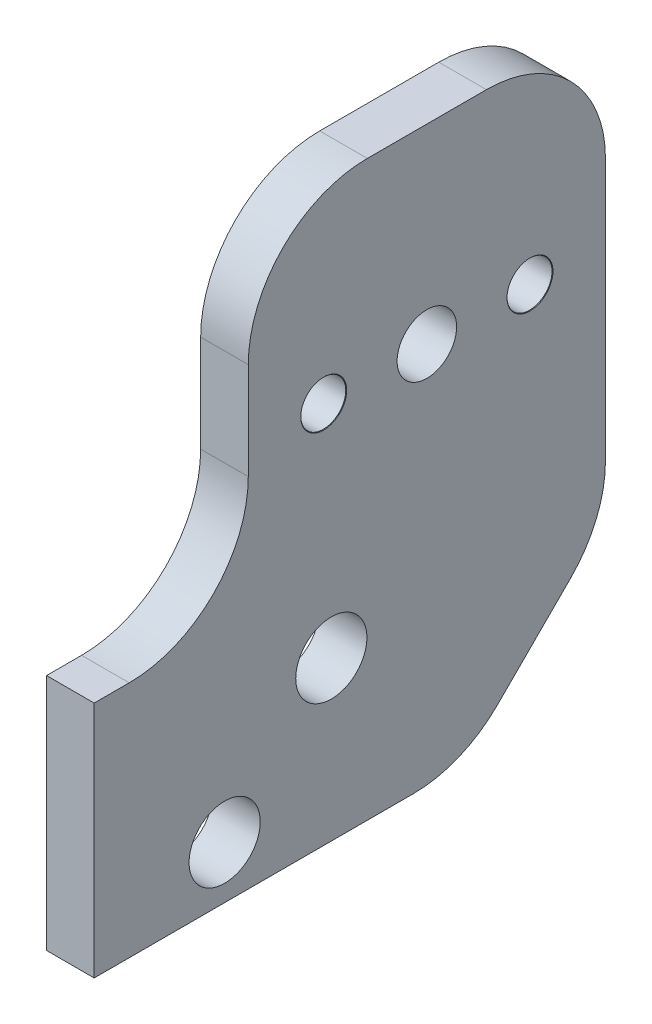
ISO-10303-21;
HEADER;
FILE_DESCRIPTION(('STEP AP214'),'2;1');
FILE_NAME('part.step','',(''),(''),'','','');
FILE_SCHEMA(('AUTOMOTIVE_DESIGN { 1 0 10303 214 1 1 1 1 }'));
ENDSEC;
DATA;
#1=APPLICATION_CONTEXT('core data for automotive mechanical design processes');
#2=APPLICATION_PROTOCOL_DEFINITION('international standard','automotive_design',2000,#1);
#3=PRODUCT_CONTEXT('',#1,'mechanical');
#4=PRODUCT('Part','Part','',(#3));
#5=PRODUCT_RELATED_PRODUCT_CATEGORY('part','',(#4));
#6=PRODUCT_DEFINITION_FORMATION('','',#4);
#7=PRODUCT_DEFINITION_CONTEXT('part definition',#1,'design');
#8=PRODUCT_DEFINITION('design','',#6,#7);
#9=PRODUCT_DEFINITION_SHAPE('','',#8);
#10=(LENGTH_UNIT() NAMED_UNIT(*) SI_UNIT(.MILLI.,.METRE.));
#11=(NAMED_UNIT(*) PLANE_ANGLE_UNIT() SI_UNIT($,.RADIAN.));
#12=(NAMED_UNIT(*) SI_UNIT($,.STERADIAN.) SOLID_ANGLE_UNIT());
#13=UNCERTAINTY_MEASURE_WITH_UNIT(LENGTH_MEASURE(1.E-05),#10,'distance_accuracy_value','');
#14=(GEOMETRIC_REPRESENTATION_CONTEXT(3) GLOBAL_UNCERTAINTY_ASSIGNED_CONTEXT((#13)) GLOBAL_UNIT_ASSIGNED_CONTEXT((#10,
#11,#12)) REPRESENTATION_CONTEXT('',''));
#15=CARTESIAN_POINT('',(0.,0.,0.));
#16=DIRECTION('',(0.,0.,1.));
#17=DIRECTION('',(1.,0.,0.));
#18=AXIS2_PLACEMENT_3D('',#15,#16,#17);
#19=CARTESIAN_POINT('',(2.54,0.,9.525));
#20=DIRECTION('',(0.,0.,-1.));
#21=DIRECTION('',(-1.,0.,0.));
#22=AXIS2_PLACEMENT_3D('',#19,#20,#21);
#23=PLANE('',#22);
#24=DIRECTION('',(0.,-1.,0.));
#25=VECTOR('',#24,1.);
#26=CARTESIAN_POINT('',(0.,0.,9.525));
#27=LINE('',#26,#25);
#28=CARTESIAN_POINT('',(0.,24.2221766,9.525));
#29=VERTEX_POINT('',#28);
#30=CARTESIAN_POINT('',(0.,19.05,9.525));
#31=VERTEX_POINT('',#30);
#32=EDGE_CURVE('E175',#29,#31,#27,.T.);
#33=ORIENTED_EDGE('',*,*,#32,.T.);
#34=DIRECTION('',(-1.,0.,0.));
#35=VECTOR('',#34,1.);
#36=CARTESIAN_POINT('',(2.54,19.05,9.525));
#37=LINE('',#36,#35);
#38=CARTESIAN_POINT('',(2.54,19.05,9.525));
#39=VERTEX_POINT('',#38);
#40=EDGE_CURVE('E60',#31,#39,#37,.F.);
#41=ORIENTED_EDGE('',*,*,#40,.T.);
#42=DIRECTION('',(0.,-1.,0.));
#43=VECTOR('',#42,1.);
#44=CARTESIAN_POINT('',(2.54,0.,9.525));
#45=LINE('',#44,#43);
#46=CARTESIAN_POINT('',(2.54,24.2221766,9.525));
#47=VERTEX_POINT('',#46);
#48=EDGE_CURVE('E179',#47,#39,#45,.T.);
#49=ORIENTED_EDGE('',*,*,#48,.F.);
#50=DIRECTION('',(-1.,0.,0.));
#51=VECTOR('',#50,1.);
#52=CARTESIAN_POINT('',(2.54,24.2221766,9.525));
#53=LINE('',#52,#51);
#54=EDGE_CURVE('E238',#47,#29,#53,.T.);
#55=ORIENTED_EDGE('',*,*,#54,.T.);
#56=EDGE_LOOP('',(#33,#41,#49,#55));
#57=FACE_BOUND('',#56,.T.);
#58=ADVANCED_FACE('F39',(#57),#23,.F.);
#59=CARTESIAN_POINT('',(2.54,0.,9.525));
#60=DIRECTION('',(0.,1.,0.));
#61=DIRECTION('',(0.,0.,1.));
#62=AXIS2_PLACEMENT_3D('',#59,#60,#61);
#63=PLANE('',#62);
#64=DIRECTION('',(0.,0.,-1.));
#65=VECTOR('',#64,1.);
#66=CARTESIAN_POINT('',(0.,0.,9.525));
#67=LINE('',#66,#65);
#68=CARTESIAN_POINT('',(0.,0.,17.7443384));
#69=VERTEX_POINT('',#68);
#70=CARTESIAN_POINT('',(0.,0.,0.725256121069179));
#71=VERTEX_POINT('',#70);
#72=EDGE_CURVE('E192',#69,#71,#67,.T.);
#73=ORIENTED_EDGE('',*,*,#72,.T.);
#74=DIRECTION('',(-1.,0.,0.));
#75=VECTOR('',#74,1.);
#76=CARTESIAN_POINT('',(2.54,0.,0.725256121069179));
#77=LINE('',#76,#75);
#78=CARTESIAN_POINT('',(2.54,0.,0.725256121069179));
#79=VERTEX_POINT('',#78);
#80=EDGE_CURVE('E233',#71,#79,#77,.F.);
#81=ORIENTED_EDGE('',*,*,#80,.T.);
#82=DIRECTION('',(0.,0.,-1.));
#83=VECTOR('',#82,1.);
#84=CARTESIAN_POINT('',(2.54,0.,9.525));
#85=LINE('',#84,#83);
#86=CARTESIAN_POINT('',(2.54,0.,17.7443384));
#87=VERTEX_POINT('',#86);
#88=EDGE_CURVE('E181',#87,#79,#85,.T.);
#89=ORIENTED_EDGE('',*,*,#88,.F.);
#90=DIRECTION('',(-1.,0.,0.));
#91=VECTOR('',#90,1.);
#92=CARTESIAN_POINT('',(2.54,0.,17.7443384));
#93=LINE('',#92,#91);
#94=EDGE_CURVE('E148',#87,#69,#93,.T.);
#95=ORIENTED_EDGE('',*,*,#94,.T.);
#96=EDGE_LOOP('',(#73,#81,#89,#95));
#97=FACE_BOUND('',#96,.T.);
#98=ADVANCED_FACE('F266',(#97),#63,.F.);
#99=CARTESIAN_POINT('',(2.54,0.,-9.525));
#100=DIRECTION('',(0.,0.,1.));
#101=DIRECTION('',(0.,-1.,0.));
#102=AXIS2_PLACEMENT_3D('',#99,#100,#101);
#103=PLANE('',#102);
#104=DIRECTION('',(0.,1.,0.));
#105=VECTOR('',#104,1.);
#106=CARTESIAN_POINT('',(2.54,0.,-9.525));
#107=LINE('',#106,#105);
#108=CARTESIAN_POINT('',(2.54,10.2502561210692,-9.525));
#109=VERTEX_POINT('',#108);
#110=CARTESIAN_POINT('',(2.54,24.2221766,-9.525));
#111=VERTEX_POINT('',#110);
#112=EDGE_CURVE('E184',#109,#111,#107,.T.);
#113=ORIENTED_EDGE('',*,*,#112,.F.);
#114=DIRECTION('',(1.,0.,0.));
#115=VECTOR('',#114,1.);
#116=CARTESIAN_POINT('',(0.,10.2502561210692,-9.525));
#117=LINE('',#116,#115);
#118=CARTESIAN_POINT('',(0.,10.2502561210692,-9.525));
#119=VERTEX_POINT('',#118);
#120=EDGE_CURVE('E210',#109,#119,#117,.F.);
#121=ORIENTED_EDGE('',*,*,#120,.T.);
#122=DIRECTION('',(0.,1.,0.));
#123=VECTOR('',#122,1.);
#124=CARTESIAN_POINT('',(0.,0.,-9.525));
#125=LINE('',#124,#123);
#126=CARTESIAN_POINT('',(0.,24.2221766,-9.525));
#127=VERTEX_POINT('',#126);
#128=EDGE_CURVE('E195',#119,#127,#125,.T.);
#129=ORIENTED_EDGE('',*,*,#128,.T.);
#130=DIRECTION('',(-1.,0.,0.));
#131=VECTOR('',#130,1.);
#132=CARTESIAN_POINT('',(2.54,24.2221766,-9.525));
#133=LINE('',#132,#131);
#134=EDGE_CURVE('E208',#127,#111,#133,.F.);
#135=ORIENTED_EDGE('',*,*,#134,.T.);
#136=EDGE_LOOP('',(#113,#121,#129,#135));
#137=FACE_BOUND('',#136,.T.);
#138=ADVANCED_FACE('F271',(#137),#103,.F.);
#139=CARTESIAN_POINT('',(2.54,30.5721766,9.525));
#140=DIRECTION('',(0.,-1.,0.));
#141=DIRECTION('',(0.,0.,-1.));
#142=AXIS2_PLACEMENT_3D('',#139,#140,#141);
#143=PLANE('',#142);
#144=DIRECTION('',(0.,0.,1.));
#145=VECTOR('',#144,1.);
#146=CARTESIAN_POINT('',(0.,30.5721766,9.525));
#147=LINE('',#146,#145);
#148=CARTESIAN_POINT('',(0.,30.5721766,-3.175));
#149=VERTEX_POINT('',#148);
#150=CARTESIAN_POINT('',(0.,30.5721766,3.175));
#151=VERTEX_POINT('',#150);
#152=EDGE_CURVE('E182',#149,#151,#147,.T.);
#153=ORIENTED_EDGE('',*,*,#152,.T.);
#154=DIRECTION('',(-1.,0.,0.));
#155=VECTOR('',#154,1.);
#156=CARTESIAN_POINT('',(2.54,30.5721766,3.175));
#157=LINE('',#156,#155);
#158=CARTESIAN_POINT('',(2.54,30.5721766,3.175));
#159=VERTEX_POINT('',#158);
#160=EDGE_CURVE('E245',#151,#159,#157,.F.);
#161=ORIENTED_EDGE('',*,*,#160,.T.);
#162=DIRECTION('',(0.,0.,1.));
#163=VECTOR('',#162,1.);
#164=CARTESIAN_POINT('',(2.54,30.5721766,9.525));
#165=LINE('',#164,#163);
#166=CARTESIAN_POINT('',(2.54,30.5721766,-3.175));
#167=VERTEX_POINT('',#166);
#168=EDGE_CURVE('E187',#167,#159,#165,.T.);
#169=ORIENTED_EDGE('',*,*,#168,.F.);
#170=DIRECTION('',(-1.,0.,0.));
#171=VECTOR('',#170,1.);
#172=CARTESIAN_POINT('',(2.54,30.5721766,-3.175));
#173=LINE('',#172,#171);
#174=EDGE_CURVE('E242',#167,#149,#173,.T.);
#175=ORIENTED_EDGE('',*,*,#174,.T.);
#176=EDGE_LOOP('',(#153,#161,#169,#175));
#177=FACE_BOUND('',#176,.T.);
#178=ADVANCED_FACE('F300',(#177),#143,.F.);
#179=CARTESIAN_POINT('',(2.54,0.,0.));
#180=DIRECTION('',(-1.,0.,0.));
#181=DIRECTION('',(0.,0.,1.));
#182=AXIS2_PLACEMENT_3D('',#179,#180,#181);
#183=PLANE('',#182);
#184=CARTESIAN_POINT('',(2.54,2.794,10.7847384));
#185=DIRECTION('',(-1.,0.,0.));
#186=DIRECTION('',(0.,0.,1.));
#187=AXIS2_PLACEMENT_3D('',#184,#185,#186);
#188=CIRCLE('',#187,1.89865);
#189=CARTESIAN_POINT('',(2.54,2.794,12.6833884));
#190=VERTEX_POINT('',#189);
#191=EDGE_CURVE('E356',#190,#190,#188,.T.);
#192=ORIENTED_EDGE('',*,*,#191,.T.);
#193=EDGE_LOOP('',(#192));
#194=FACE_BOUND('',#193,.T.);
#195=CARTESIAN_POINT('',(2.54,8.4582,5.0951384));
#196=DIRECTION('',(-1.,0.,0.));
#197=DIRECTION('',(0.,0.,1.));
#198=AXIS2_PLACEMENT_3D('',#195,#196,#197);
#199=CIRCLE('',#198,1.89865);
#200=CARTESIAN_POINT('',(2.54,8.4582,6.9937884));
#201=VERTEX_POINT('',#200);
#202=EDGE_CURVE('E157',#201,#201,#199,.T.);
#203=ORIENTED_EDGE('',*,*,#202,.T.);
#204=EDGE_LOOP('',(#203));
#205=FACE_BOUND('',#204,.T.);
#206=CARTESIAN_POINT('',(2.54,20.4121766,5.5));
#207=DIRECTION('',(1.,0.,0.));
#208=DIRECTION('',(0.,0.,-1.));
#209=AXIS2_PLACEMENT_3D('',#206,#207,#208);
#210=CIRCLE('',#209,1.225);
#211=CARTESIAN_POINT('',(2.54,20.4121766,4.275));
#212=VERTEX_POINT('',#211);
#213=EDGE_CURVE('E147',#212,#212,#210,.T.);
#214=ORIENTED_EDGE('',*,*,#213,.F.);
#215=EDGE_LOOP('',(#214));
#216=FACE_BOUND('',#215,.T.);
#217=CARTESIAN_POINT('',(2.54,20.4121766,-5.5));
#218=DIRECTION('',(1.,0.,0.));
#219=DIRECTION('',(0.,0.,-1.));
#220=AXIS2_PLACEMENT_3D('',#217,#218,#219);
#221=CIRCLE('',#220,1.225);
#222=CARTESIAN_POINT('',(2.54,20.4121766,-6.725));
#223=VERTEX_POINT('',#222);
#224=EDGE_CURVE('E165',#223,#223,#221,.T.);
#225=ORIENTED_EDGE('',*,*,#224,.F.);
#226=EDGE_LOOP('',(#225));
#227=FACE_BOUND('',#226,.T.);
#228=CARTESIAN_POINT('',(2.54,20.4121766,0.));
#229=DIRECTION('',(1.,0.,0.));
#230=DIRECTION('',(0.,0.,-1.));
#231=AXIS2_PLACEMENT_3D('',#228,#229,#230);
#232=CIRCLE('',#231,1.5875);
#233=CARTESIAN_POINT('',(2.54,20.4121766,-1.5875));
#234=VERTEX_POINT('',#233);
#235=EDGE_CURVE('E176',#234,#234,#232,.T.);
#236=ORIENTED_EDGE('',*,*,#235,.F.);
#237=EDGE_LOOP('',(#236));
#238=FACE_BOUND('',#237,.T.);
#239=DIRECTION('',(0.,-0.707106781186546,0.707106781186549));
#240=VECTOR('',#239,1.);
#241=CARTESIAN_POINT('',(2.54,7.62,-9.525));
#242=LINE('',#241,#240);
#243=CARTESIAN_POINT('',(2.54,1.85987193946541,-3.76487193946539));
#244=VERTEX_POINT('',#243);
#245=CARTESIAN_POINT('',(2.54,5.76012806053458,-7.66512806053457));
#246=VERTEX_POINT('',#245);
#247=EDGE_CURVE('E206',#244,#246,#242,.F.);
#248=ORIENTED_EDGE('',*,*,#247,.T.);
#249=CARTESIAN_POINT('',(2.54,10.2502561210692,-3.175));
#250=DIRECTION('',(-1.,0.,0.));
#251=DIRECTION('',(0.,0.,1.));
#252=AXIS2_PLACEMENT_3D('',#249,#250,#251);
#253=CIRCLE('',#252,6.35);
#254=EDGE_CURVE('E231',#246,#109,#253,.F.);
#255=ORIENTED_EDGE('',*,*,#254,.T.);
#256=ORIENTED_EDGE('',*,*,#112,.T.);
#257=CARTESIAN_POINT('',(2.54,24.2221766,-3.175));
#258=DIRECTION('',(-1.,0.,0.));
#259=DIRECTION('',(0.,0.,1.));
#260=AXIS2_PLACEMENT_3D('',#257,#258,#259);
#261=CIRCLE('',#260,6.35);
#262=EDGE_CURVE('E225',#111,#167,#261,.F.);
#263=ORIENTED_EDGE('',*,*,#262,.T.);
#264=ORIENTED_EDGE('',*,*,#168,.T.);
#265=CARTESIAN_POINT('',(2.54,24.2221766,3.175));
#266=DIRECTION('',(-1.,0.,0.));
#267=DIRECTION('',(0.,0.,1.));
#268=AXIS2_PLACEMENT_3D('',#265,#266,#267);
#269=CIRCLE('',#268,6.35);
#270=EDGE_CURVE('E227',#159,#47,#269,.F.);
#271=ORIENTED_EDGE('',*,*,#270,.T.);
#272=ORIENTED_EDGE('',*,*,#48,.T.);
#273=CARTESIAN_POINT('',(2.54,19.05,15.875));
#274=DIRECTION('',(-1.,0.,0.));
#275=DIRECTION('',(0.,0.,1.));
#276=AXIS2_PLACEMENT_3D('',#273,#274,#275);
#277=CIRCLE('',#276,6.35);
#278=CARTESIAN_POINT('',(2.54,12.7,15.875));
#279=VERTEX_POINT('',#278);
#280=EDGE_CURVE('E11',#39,#279,#277,.T.);
#281=ORIENTED_EDGE('',*,*,#280,.T.);
#282=DIRECTION('',(0.,0.,1.));
#283=VECTOR('',#282,1.);
#284=CARTESIAN_POINT('',(2.54,12.7,9.525));
#285=LINE('',#284,#283);
#286=CARTESIAN_POINT('',(2.54,12.7,17.7443384));
#287=VERTEX_POINT('',#286);
#288=EDGE_CURVE('E126',#279,#287,#285,.T.);
#289=ORIENTED_EDGE('',*,*,#288,.T.);
#290=DIRECTION('',(0.,-1.,0.));
#291=VECTOR('',#290,1.);
#292=CARTESIAN_POINT('',(2.54,0.,17.7443384));
#293=LINE('',#292,#291);
#294=EDGE_CURVE('E132',#287,#87,#293,.T.);
#295=ORIENTED_EDGE('',*,*,#294,.T.);
#296=ORIENTED_EDGE('',*,*,#88,.T.);
#297=CARTESIAN_POINT('',(2.54,6.35,0.725256121069179));
#298=DIRECTION('',(-1.,0.,0.));
#299=DIRECTION('',(0.,0.,1.));
#300=AXIS2_PLACEMENT_3D('',#297,#298,#299);
#301=CIRCLE('',#300,6.35);
#302=EDGE_CURVE('E229',#79,#244,#301,.F.);
#303=ORIENTED_EDGE('',*,*,#302,.T.);
#304=EDGE_LOOP('',(#248,#255,#256,#263,#264,#271,#272,#281,#289,#295,#296,#303));
#305=FACE_BOUND('',#304,.T.);
#306=ADVANCED_FACE('F129',(#194,#205,#216,#227,#238,#305),#183,.F.);
#307=CARTESIAN_POINT('',(0.,0.,0.));
#308=DIRECTION('',(-1.,0.,0.));
#309=DIRECTION('',(0.,0.,1.));
#310=AXIS2_PLACEMENT_3D('',#307,#308,#309);
#311=PLANE('',#310);
#312=CARTESIAN_POINT('',(0.,2.794,10.7847384));
#313=DIRECTION('',(-1.,0.,0.));
#314=DIRECTION('',(0.,0.,1.));
#315=AXIS2_PLACEMENT_3D('',#312,#313,#314);
#316=CIRCLE('',#315,1.89864999999999);
#317=CARTESIAN_POINT('',(0.,2.794,12.6833884));
#318=VERTEX_POINT('',#317);
#319=EDGE_CURVE('E359',#318,#318,#316,.T.);
#320=ORIENTED_EDGE('',*,*,#319,.F.);
#321=EDGE_LOOP('',(#320));
#322=FACE_BOUND('',#321,.T.);
#323=CARTESIAN_POINT('',(0.,8.4582,5.0951384));
#324=DIRECTION('',(-1.,0.,0.));
#325=DIRECTION('',(0.,0.,1.));
#326=AXIS2_PLACEMENT_3D('',#323,#324,#325);
#327=CIRCLE('',#326,1.89864999999999);
#328=CARTESIAN_POINT('',(0.,8.4582,6.99378839999998));
#329=VERTEX_POINT('',#328);
#330=EDGE_CURVE('E361',#329,#329,#327,.T.);
#331=ORIENTED_EDGE('',*,*,#330,.F.);
#332=EDGE_LOOP('',(#331));
#333=FACE_BOUND('',#332,.T.);
#334=CARTESIAN_POINT('',(0.,20.4121766,5.5));
#335=DIRECTION('',(-1.,0.,0.));
#336=DIRECTION('',(0.,0.,1.));
#337=AXIS2_PLACEMENT_3D('',#334,#335,#336);
#338=CIRCLE('',#337,1.2);
#339=CARTESIAN_POINT('',(0.,20.4121766,6.7));
#340=VERTEX_POINT('',#339);
#341=EDGE_CURVE('E164',#340,#340,#338,.T.);
#342=ORIENTED_EDGE('',*,*,#341,.F.);
#343=EDGE_LOOP('',(#342));
#344=FACE_BOUND('',#343,.T.);
#345=CARTESIAN_POINT('',(0.,20.4121766,-5.5));
#346=DIRECTION('',(-1.,0.,0.));
#347=DIRECTION('',(0.,0.,1.));
#348=AXIS2_PLACEMENT_3D('',#345,#346,#347);
#349=CIRCLE('',#348,1.2);
#350=CARTESIAN_POINT('',(0.,20.4121766,-4.3));
#351=VERTEX_POINT('',#350);
#352=EDGE_CURVE('E171',#351,#351,#349,.T.);
#353=ORIENTED_EDGE('',*,*,#352,.F.);
#354=EDGE_LOOP('',(#353));
#355=FACE_BOUND('',#354,.T.);
#356=CARTESIAN_POINT('',(0.,20.4121766,0.));
#357=DIRECTION('',(1.,0.,0.));
#358=DIRECTION('',(0.,0.,-1.));
#359=AXIS2_PLACEMENT_3D('',#356,#357,#358);
#360=CIRCLE('',#359,1.5875);
#361=CARTESIAN_POINT('',(0.,20.4121766,-1.5875));
#362=VERTEX_POINT('',#361);
#363=EDGE_CURVE('E172',#362,#362,#360,.T.);
#364=ORIENTED_EDGE('',*,*,#363,.T.);
#365=EDGE_LOOP('',(#364));
#366=FACE_BOUND('',#365,.T.);
#367=ORIENTED_EDGE('',*,*,#128,.F.);
#368=CARTESIAN_POINT('',(0.,10.2502561210692,-3.175));
#369=DIRECTION('',(-1.,0.,0.));
#370=DIRECTION('',(0.,0.,1.));
#371=AXIS2_PLACEMENT_3D('',#368,#369,#370);
#372=CIRCLE('',#371,6.35);
#373=CARTESIAN_POINT('',(0.,5.76012806053458,-7.66512806053457));
#374=VERTEX_POINT('',#373);
#375=EDGE_CURVE('E219',#119,#374,#372,.T.);
#376=ORIENTED_EDGE('',*,*,#375,.T.);
#377=DIRECTION('',(0.,0.707106781186546,-0.707106781186549));
#378=VECTOR('',#377,1.);
#379=CARTESIAN_POINT('',(0.,-0.952499999999983,-0.952499999999979));
#380=LINE('',#379,#378);
#381=CARTESIAN_POINT('',(0.,1.85987193946541,-3.76487193946539));
#382=VERTEX_POINT('',#381);
#383=EDGE_CURVE('E190',#374,#382,#380,.F.);
#384=ORIENTED_EDGE('',*,*,#383,.T.);
#385=CARTESIAN_POINT('',(0.,6.35,0.725256121069179));
#386=DIRECTION('',(-1.,0.,0.));
#387=DIRECTION('',(0.,0.,1.));
#388=AXIS2_PLACEMENT_3D('',#385,#386,#387);
#389=CIRCLE('',#388,6.35);
#390=EDGE_CURVE('E217',#382,#71,#389,.T.);
#391=ORIENTED_EDGE('',*,*,#390,.T.);
#392=ORIENTED_EDGE('',*,*,#72,.F.);
#393=DIRECTION('',(0.,-1.,0.));
#394=VECTOR('',#393,1.);
#395=CARTESIAN_POINT('',(0.,0.,17.7443384));
#396=LINE('',#395,#394);
#397=CARTESIAN_POINT('',(0.,12.7,17.7443384));
#398=VERTEX_POINT('',#397);
#399=EDGE_CURVE('E137',#398,#69,#396,.T.);
#400=ORIENTED_EDGE('',*,*,#399,.F.);
#401=DIRECTION('',(0.,0.,1.));
#402=VECTOR('',#401,1.);
#403=CARTESIAN_POINT('',(0.,12.7,9.525));
#404=LINE('',#403,#402);
#405=CARTESIAN_POINT('',(0.,12.7,15.875));
#406=VERTEX_POINT('',#405);
#407=EDGE_CURVE('E143',#406,#398,#404,.T.);
#408=ORIENTED_EDGE('',*,*,#407,.F.);
#409=CARTESIAN_POINT('',(0.,19.05,15.875));
#410=DIRECTION('',(-1.,0.,0.));
#411=DIRECTION('',(0.,0.,1.));
#412=AXIS2_PLACEMENT_3D('',#409,#410,#411);
#413=CIRCLE('',#412,6.35);
#414=EDGE_CURVE('E47',#406,#31,#413,.F.);
#415=ORIENTED_EDGE('',*,*,#414,.T.);
#416=ORIENTED_EDGE('',*,*,#32,.F.);
#417=CARTESIAN_POINT('',(0.,24.2221766,3.175));
#418=DIRECTION('',(-1.,0.,0.));
#419=DIRECTION('',(0.,0.,1.));
#420=AXIS2_PLACEMENT_3D('',#417,#418,#419);
#421=CIRCLE('',#420,6.35);
#422=EDGE_CURVE('E215',#29,#151,#421,.T.);
#423=ORIENTED_EDGE('',*,*,#422,.T.);
#424=ORIENTED_EDGE('',*,*,#152,.F.);
#425=CARTESIAN_POINT('',(0.,24.2221766,-3.175));
#426=DIRECTION('',(-1.,0.,0.));
#427=DIRECTION('',(0.,0.,1.));
#428=AXIS2_PLACEMENT_3D('',#425,#426,#427);
#429=CIRCLE('',#428,6.35);
#430=EDGE_CURVE('E213',#149,#127,#429,.T.);
#431=ORIENTED_EDGE('',*,*,#430,.T.);
#432=EDGE_LOOP('',(#367,#376,#384,#391,#392,#400,#408,#415,#416,#423,#424,#431));
#433=FACE_BOUND('',#432,.T.);
#434=ADVANCED_FACE('F249',(#322,#333,#344,#355,#366,#433),#311,.T.);
#435=CARTESIAN_POINT('',(0.,20.4121766,0.));
#436=DIRECTION('',(1.,0.,0.));
#437=DIRECTION('',(0.,0.,-1.));
#438=AXIS2_PLACEMENT_3D('',#435,#436,#437);
#439=CYLINDRICAL_SURFACE('',#438,1.5875);
#440=ORIENTED_EDGE('',*,*,#363,.F.);
#441=EDGE_LOOP('',(#440));
#442=FACE_BOUND('',#441,.T.);
#443=ORIENTED_EDGE('',*,*,#235,.T.);
#444=EDGE_LOOP('',(#443));
#445=FACE_BOUND('',#444,.T.);
#446=ADVANCED_FACE('F318',(#442,#445),#439,.F.);
#447=CARTESIAN_POINT('',(2.54,20.4121766,-5.5));
#448=DIRECTION('',(1.,0.,0.));
#449=DIRECTION('',(0.,0.,-1.));
#450=AXIS2_PLACEMENT_3D('',#447,#448,#449);
#451=CYLINDRICAL_SURFACE('',#450,1.2);
#452=ORIENTED_EDGE('',*,*,#352,.T.);
#453=EDGE_LOOP('',(#452));
#454=FACE_BOUND('',#453,.T.);
#455=CARTESIAN_POINT('',(2.515,20.4121766,-5.5));
#456=DIRECTION('',(1.,0.,0.));
#457=DIRECTION('',(0.,0.,-1.));
#458=AXIS2_PLACEMENT_3D('',#455,#456,#457);
#459=CIRCLE('',#458,1.2);
#460=CARTESIAN_POINT('',(2.515,20.4121766,-6.7));
#461=VERTEX_POINT('',#460);
#462=EDGE_CURVE('E168',#461,#461,#459,.T.);
#463=ORIENTED_EDGE('',*,*,#462,.T.);
#464=EDGE_LOOP('',(#463));
#465=FACE_BOUND('',#464,.T.);
#466=ADVANCED_FACE('F323',(#454,#465),#451,.F.);
#467=CARTESIAN_POINT('',(2.54,20.4121766,-5.5));
#468=DIRECTION('',(1.,0.,0.));
#469=DIRECTION('',(0.,0.,-1.));
#470=AXIS2_PLACEMENT_3D('',#467,#468,#469);
#471=CONICAL_SURFACE('',#470,1.225,0.785398163397414);
#472=ORIENTED_EDGE('',*,*,#462,.F.);
#473=EDGE_LOOP('',(#472));
#474=FACE_BOUND('',#473,.T.);
#475=ORIENTED_EDGE('',*,*,#224,.T.);
#476=EDGE_LOOP('',(#475));
#477=FACE_BOUND('',#476,.T.);
#478=ADVANCED_FACE('F327',(#474,#477),#471,.F.);
#479=CARTESIAN_POINT('',(2.54,20.4121766,5.5));
#480=DIRECTION('',(1.,0.,0.));
#481=DIRECTION('',(0.,0.,-1.));
#482=AXIS2_PLACEMENT_3D('',#479,#480,#481);
#483=CYLINDRICAL_SURFACE('',#482,1.2);
#484=ORIENTED_EDGE('',*,*,#341,.T.);
#485=EDGE_LOOP('',(#484));
#486=FACE_BOUND('',#485,.T.);
#487=CARTESIAN_POINT('',(2.515,20.4121766,5.5));
#488=DIRECTION('',(1.,0.,0.));
#489=DIRECTION('',(0.,0.,-1.));
#490=AXIS2_PLACEMENT_3D('',#487,#488,#489);
#491=CIRCLE('',#490,1.2);
#492=CARTESIAN_POINT('',(2.515,20.4121766,4.3));
#493=VERTEX_POINT('',#492);
#494=EDGE_CURVE('E161',#493,#493,#491,.T.);
#495=ORIENTED_EDGE('',*,*,#494,.T.);
#496=EDGE_LOOP('',(#495));
#497=FACE_BOUND('',#496,.T.);
#498=ADVANCED_FACE('F331',(#486,#497),#483,.F.);
#499=CARTESIAN_POINT('',(2.54,20.4121766,5.5));
#500=DIRECTION('',(1.,0.,0.));
#501=DIRECTION('',(0.,0.,-1.));
#502=AXIS2_PLACEMENT_3D('',#499,#500,#501);
#503=CONICAL_SURFACE('',#502,1.225,0.785398163397414);
#504=ORIENTED_EDGE('',*,*,#494,.F.);
#505=EDGE_LOOP('',(#504));
#506=FACE_BOUND('',#505,.T.);
#507=ORIENTED_EDGE('',*,*,#213,.T.);
#508=EDGE_LOOP('',(#507));
#509=FACE_BOUND('',#508,.T.);
#510=ADVANCED_FACE('F335',(#506,#509),#503,.F.);
#511=CARTESIAN_POINT('',(2.54,12.7,9.525));
#512=DIRECTION('',(0.,-1.,0.));
#513=DIRECTION('',(0.,0.,-1.));
#514=AXIS2_PLACEMENT_3D('',#511,#512,#513);
#515=PLANE('',#514);
#516=ORIENTED_EDGE('',*,*,#288,.F.);
#517=DIRECTION('',(-1.,0.,0.));
#518=VECTOR('',#517,1.);
#519=CARTESIAN_POINT('',(0.,12.7,15.875));
#520=LINE('',#519,#518);
#521=EDGE_CURVE('E236',#279,#406,#520,.T.);
#522=ORIENTED_EDGE('',*,*,#521,.T.);
#523=ORIENTED_EDGE('',*,*,#407,.T.);
#524=DIRECTION('',(-1.,0.,0.));
#525=VECTOR('',#524,1.);
#526=CARTESIAN_POINT('',(2.54,12.7,17.7443384));
#527=LINE('',#526,#525);
#528=EDGE_CURVE('E140',#287,#398,#527,.T.);
#529=ORIENTED_EDGE('',*,*,#528,.F.);
#530=EDGE_LOOP('',(#516,#522,#523,#529));
#531=FACE_BOUND('',#530,.T.);
#532=ADVANCED_FACE('F141',(#531),#515,.F.);
#533=CARTESIAN_POINT('',(2.54,0.,17.7443384));
#534=DIRECTION('',(0.,0.,-1.));
#535=DIRECTION('',(-1.,0.,0.));
#536=AXIS2_PLACEMENT_3D('',#533,#534,#535);
#537=PLANE('',#536);
#538=ORIENTED_EDGE('',*,*,#399,.T.);
#539=ORIENTED_EDGE('',*,*,#94,.F.);
#540=ORIENTED_EDGE('',*,*,#294,.F.);
#541=ORIENTED_EDGE('',*,*,#528,.T.);
#542=EDGE_LOOP('',(#538,#539,#540,#541));
#543=FACE_BOUND('',#542,.T.);
#544=ADVANCED_FACE('F150',(#543),#537,.F.);
#545=CARTESIAN_POINT('',(2.54,7.62,-9.525));
#546=DIRECTION('',(0.,0.707106781186549,0.707106781186546));
#547=DIRECTION('',(-1.,0.,0.));
#548=AXIS2_PLACEMENT_3D('',#545,#546,#547);
#549=PLANE('',#548);
#550=ORIENTED_EDGE('',*,*,#383,.F.);
#551=DIRECTION('',(-1.,0.,0.));
#552=VECTOR('',#551,1.);
#553=CARTESIAN_POINT('',(2.54,5.76012806053458,-7.66512806053457));
#554=LINE('',#553,#552);
#555=EDGE_CURVE('E223',#374,#246,#554,.F.);
#556=ORIENTED_EDGE('',*,*,#555,.T.);
#557=ORIENTED_EDGE('',*,*,#247,.F.);
#558=DIRECTION('',(1.,0.,0.));
#559=VECTOR('',#558,1.);
#560=CARTESIAN_POINT('',(0.,1.85987193946541,-3.76487193946539));
#561=LINE('',#560,#559);
#562=EDGE_CURVE('E221',#244,#382,#561,.F.);
#563=ORIENTED_EDGE('',*,*,#562,.T.);
#564=EDGE_LOOP('',(#550,#556,#557,#563));
#565=FACE_BOUND('',#564,.T.);
#566=ADVANCED_FACE('F277',(#565),#549,.F.);
#567=CARTESIAN_POINT('',(2.54,10.2502561210692,-3.175));
#568=DIRECTION('',(-1.,0.,0.));
#569=DIRECTION('',(0.,0.,1.));
#570=AXIS2_PLACEMENT_3D('',#567,#568,#569);
#571=CYLINDRICAL_SURFACE('',#570,6.35);
#572=ORIENTED_EDGE('',*,*,#254,.F.);
#573=ORIENTED_EDGE('',*,*,#555,.F.);
#574=ORIENTED_EDGE('',*,*,#375,.F.);
#575=ORIENTED_EDGE('',*,*,#120,.F.);
#576=EDGE_LOOP('',(#572,#573,#574,#575));
#577=FACE_BOUND('',#576,.T.);
#578=ADVANCED_FACE('F262',(#577),#571,.T.);
#579=CARTESIAN_POINT('',(2.54,6.35,0.725256121069179));
#580=DIRECTION('',(1.,0.,0.));
#581=DIRECTION('',(0.,0.,-1.));
#582=AXIS2_PLACEMENT_3D('',#579,#580,#581);
#583=CYLINDRICAL_SURFACE('',#582,6.35);
#584=ORIENTED_EDGE('',*,*,#390,.F.);
#585=ORIENTED_EDGE('',*,*,#562,.F.);
#586=ORIENTED_EDGE('',*,*,#302,.F.);
#587=ORIENTED_EDGE('',*,*,#80,.F.);
#588=EDGE_LOOP('',(#584,#585,#586,#587));
#589=FACE_BOUND('',#588,.T.);
#590=ADVANCED_FACE('F255',(#589),#583,.T.);
#591=CARTESIAN_POINT('',(2.54,19.05,15.875));
#592=DIRECTION('',(1.,0.,0.));
#593=DIRECTION('',(0.,0.,-1.));
#594=AXIS2_PLACEMENT_3D('',#591,#592,#593);
#595=CYLINDRICAL_SURFACE('',#594,6.35);
#596=ORIENTED_EDGE('',*,*,#280,.F.);
#597=ORIENTED_EDGE('',*,*,#40,.F.);
#598=ORIENTED_EDGE('',*,*,#414,.F.);
#599=ORIENTED_EDGE('',*,*,#521,.F.);
#600=EDGE_LOOP('',(#596,#597,#598,#599));
#601=FACE_BOUND('',#600,.T.);
#602=ADVANCED_FACE('F252',(#601),#595,.F.);
#603=CARTESIAN_POINT('',(2.54,24.2221766,3.175));
#604=DIRECTION('',(-1.,0.,0.));
#605=DIRECTION('',(0.,0.,1.));
#606=AXIS2_PLACEMENT_3D('',#603,#604,#605);
#607=CYLINDRICAL_SURFACE('',#606,6.35);
#608=ORIENTED_EDGE('',*,*,#270,.F.);
#609=ORIENTED_EDGE('',*,*,#160,.F.);
#610=ORIENTED_EDGE('',*,*,#422,.F.);
#611=ORIENTED_EDGE('',*,*,#54,.F.);
#612=EDGE_LOOP('',(#608,#609,#610,#611));
#613=FACE_BOUND('',#612,.T.);
#614=ADVANCED_FACE('F254',(#613),#607,.T.);
#615=CARTESIAN_POINT('',(2.54,24.2221766,-3.175));
#616=DIRECTION('',(-1.,0.,0.));
#617=DIRECTION('',(0.,0.,1.));
#618=AXIS2_PLACEMENT_3D('',#615,#616,#617);
#619=CYLINDRICAL_SURFACE('',#618,6.35);
#620=ORIENTED_EDGE('',*,*,#262,.F.);
#621=ORIENTED_EDGE('',*,*,#134,.F.);
#622=ORIENTED_EDGE('',*,*,#430,.F.);
#623=ORIENTED_EDGE('',*,*,#174,.F.);
#624=EDGE_LOOP('',(#620,#621,#622,#623));
#625=FACE_BOUND('',#624,.T.);
#626=ADVANCED_FACE('F41',(#625),#619,.T.);
#627=CARTESIAN_POINT('',(0.,8.4582,5.0951384));
#628=DIRECTION('',(-1.,0.,0.));
#629=DIRECTION('',(0.,0.,1.));
#630=AXIS2_PLACEMENT_3D('',#627,#628,#629);
#631=CYLINDRICAL_SURFACE('',#630,1.89864999999999);
#632=ORIENTED_EDGE('',*,*,#202,.F.);
#633=EDGE_LOOP('',(#632));
#634=FACE_BOUND('',#633,.T.);
#635=ORIENTED_EDGE('',*,*,#330,.T.);
#636=EDGE_LOOP('',(#635));
#637=FACE_BOUND('',#636,.T.);
#638=ADVANCED_FACE('F344',(#634,#637),#631,.F.);
#639=CARTESIAN_POINT('',(0.,2.794,10.7847384));
#640=DIRECTION('',(-1.,0.,0.));
#641=DIRECTION('',(0.,0.,1.));
#642=AXIS2_PLACEMENT_3D('',#639,#640,#641);
#643=CYLINDRICAL_SURFACE('',#642,1.89864999999999);
#644=ORIENTED_EDGE('',*,*,#191,.F.);
#645=EDGE_LOOP('',(#644));
#646=FACE_BOUND('',#645,.T.);
#647=ORIENTED_EDGE('',*,*,#319,.T.);
#648=EDGE_LOOP('',(#647));
#649=FACE_BOUND('',#648,.T.);
#650=ADVANCED_FACE('F347',(#646,#649),#643,.F.);
#651=CLOSED_SHELL('',(#58,#98,#138,#178,#306,#434,#446,#466,#478,#498,#510,#532,#544,#566,#578,
#590,#602,#614,#626,#638,#650));
#652=MANIFOLD_SOLID_BREP('B2',#651);
#653=ADVANCED_BREP_SHAPE_REPRESENTATION('',(#18,#652),#14);
#654=SHAPE_DEFINITION_REPRESENTATION(#9,#653);
ENDSEC;
END-ISO-10303-21;
